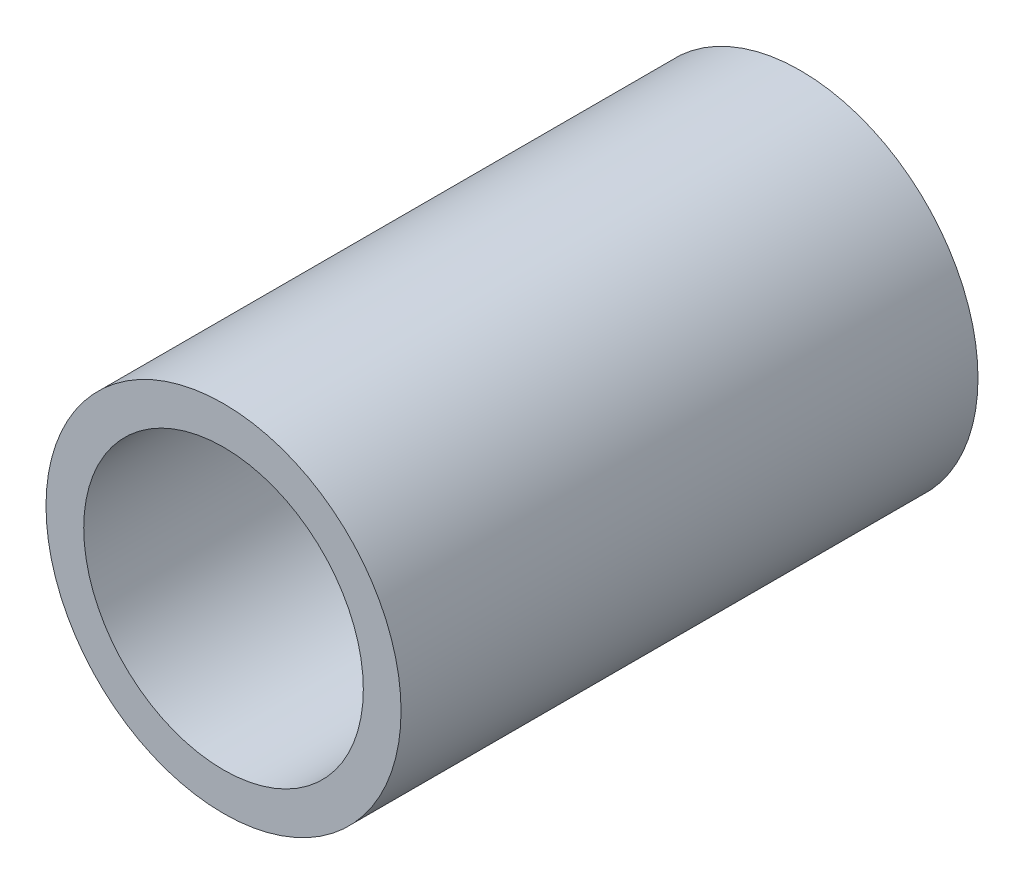
ISO-10303-21;
HEADER;
FILE_DESCRIPTION(('STEP AP214'),'2;1');
FILE_NAME('part.step','',(''),(''),'','','');
FILE_SCHEMA(('AUTOMOTIVE_DESIGN { 1 0 10303 214 1 1 1 1 }'));
ENDSEC;
DATA;
#1=APPLICATION_CONTEXT('core data for automotive mechanical design processes');
#2=APPLICATION_PROTOCOL_DEFINITION('international standard','automotive_design',2000,#1);
#3=PRODUCT_CONTEXT('',#1,'mechanical');
#4=PRODUCT('Part','Part','',(#3));
#5=PRODUCT_RELATED_PRODUCT_CATEGORY('part','',(#4));
#6=PRODUCT_DEFINITION_FORMATION('','',#4);
#7=PRODUCT_DEFINITION_CONTEXT('part definition',#1,'design');
#8=PRODUCT_DEFINITION('design','',#6,#7);
#9=PRODUCT_DEFINITION_SHAPE('','',#8);
#10=(LENGTH_UNIT() NAMED_UNIT(*) SI_UNIT(.MILLI.,.METRE.));
#11=(NAMED_UNIT(*) PLANE_ANGLE_UNIT() SI_UNIT($,.RADIAN.));
#12=(NAMED_UNIT(*) SI_UNIT($,.STERADIAN.) SOLID_ANGLE_UNIT());
#13=UNCERTAINTY_MEASURE_WITH_UNIT(LENGTH_MEASURE(1.E-05),#10,'distance_accuracy_value','');
#14=(GEOMETRIC_REPRESENTATION_CONTEXT(3) GLOBAL_UNCERTAINTY_ASSIGNED_CONTEXT((#13)) GLOBAL_UNIT_ASSIGNED_CONTEXT((#10,
#11,#12)) REPRESENTATION_CONTEXT('',''));
#15=CARTESIAN_POINT('',(0.,0.,0.));
#16=DIRECTION('',(0.,0.,1.));
#17=DIRECTION('',(1.,0.,0.));
#18=AXIS2_PLACEMENT_3D('',#15,#16,#17);
#19=CARTESIAN_POINT('',(130.584621174782,33.1760252329142,596.785052486104));
#20=DIRECTION('',(0.,0.,1.));
#21=DIRECTION('',(1.,0.,0.));
#22=AXIS2_PLACEMENT_3D('',#19,#20,#21);
#23=PLANE('',#22);
#24=CARTESIAN_POINT('',(130.584621174782,33.1760252329142,596.785052486104));
#25=DIRECTION('',(0.,0.,1.));
#26=DIRECTION('',(1.,0.,0.));
#27=AXIS2_PLACEMENT_3D('',#24,#25,#26);
#28=CIRCLE('',#27,126.);
#29=CARTESIAN_POINT('',(256.584621174782,33.1760252329142,596.785052486104));
#30=VERTEX_POINT('',#29);
#31=EDGE_CURVE('E59',#30,#30,#28,.T.);
#32=ORIENTED_EDGE('',*,*,#31,.F.);
#33=EDGE_LOOP('',(#32));
#34=FACE_BOUND('',#33,.T.);
#35=CARTESIAN_POINT('',(130.584621174782,33.1760252329142,596.785052486104));
#36=DIRECTION('',(0.,0.,1.));
#37=DIRECTION('',(1.,0.,0.));
#38=AXIS2_PLACEMENT_3D('',#35,#36,#37);
#39=CIRCLE('',#38,160.);
#40=CARTESIAN_POINT('',(290.584621174782,33.1760252329142,596.785052486104));
#41=VERTEX_POINT('',#40);
#42=EDGE_CURVE('E13',#41,#41,#39,.T.);
#43=ORIENTED_EDGE('',*,*,#42,.T.);
#44=EDGE_LOOP('',(#43));
#45=FACE_BOUND('',#44,.T.);
#46=ADVANCED_FACE('F48',(#34,#45),#23,.T.);
#47=CARTESIAN_POINT('',(130.584621174782,33.1760252329142,76.7850524861044));
#48=DIRECTION('',(0.,0.,1.));
#49=DIRECTION('',(1.,0.,0.));
#50=AXIS2_PLACEMENT_3D('',#47,#48,#49);
#51=PLANE('',#50);
#52=CARTESIAN_POINT('',(130.584621174782,33.1760252329142,76.7850524861044));
#53=DIRECTION('',(0.,0.,1.));
#54=DIRECTION('',(1.,0.,0.));
#55=AXIS2_PLACEMENT_3D('',#52,#53,#54);
#56=CIRCLE('',#55,160.);
#57=CARTESIAN_POINT('',(290.584621174782,33.1760252329142,76.7850524861044));
#58=VERTEX_POINT('',#57);
#59=EDGE_CURVE('E52',#58,#58,#56,.T.);
#60=ORIENTED_EDGE('',*,*,#59,.F.);
#61=EDGE_LOOP('',(#60));
#62=FACE_BOUND('',#61,.T.);
#63=CARTESIAN_POINT('',(130.584621174782,33.1760252329142,76.7850524861044));
#64=DIRECTION('',(0.,0.,1.));
#65=DIRECTION('',(1.,0.,0.));
#66=AXIS2_PLACEMENT_3D('',#63,#64,#65);
#67=CIRCLE('',#66,126.);
#68=CARTESIAN_POINT('',(256.584621174782,33.1760252329142,76.7850524861044));
#69=VERTEX_POINT('',#68);
#70=EDGE_CURVE('E61',#69,#69,#67,.T.);
#71=ORIENTED_EDGE('',*,*,#70,.T.);
#72=EDGE_LOOP('',(#71));
#73=FACE_BOUND('',#72,.T.);
#74=ADVANCED_FACE('F71',(#62,#73),#51,.F.);
#75=CARTESIAN_POINT('',(130.584621174782,33.1760252329142,596.785052486104));
#76=DIRECTION('',(0.,0.,-1.));
#77=DIRECTION('',(-1.,0.,0.));
#78=AXIS2_PLACEMENT_3D('',#75,#76,#77);
#79=CYLINDRICAL_SURFACE('',#78,160.);
#80=ORIENTED_EDGE('',*,*,#42,.F.);
#81=EDGE_LOOP('',(#80));
#82=FACE_BOUND('',#81,.T.);
#83=ORIENTED_EDGE('',*,*,#59,.T.);
#84=EDGE_LOOP('',(#83));
#85=FACE_BOUND('',#84,.T.);
#86=ADVANCED_FACE('F50',(#82,#85),#79,.T.);
#87=CARTESIAN_POINT('',(130.584621174782,33.1760252329142,596.785052486104));
#88=DIRECTION('',(0.,0.,-1.));
#89=DIRECTION('',(-1.,0.,0.));
#90=AXIS2_PLACEMENT_3D('',#87,#88,#89);
#91=CYLINDRICAL_SURFACE('',#90,126.);
#92=ORIENTED_EDGE('',*,*,#31,.T.);
#93=EDGE_LOOP('',(#92));
#94=FACE_BOUND('',#93,.T.);
#95=ORIENTED_EDGE('',*,*,#70,.F.);
#96=EDGE_LOOP('',(#95));
#97=FACE_BOUND('',#96,.T.);
#98=ADVANCED_FACE('F67',(#94,#97),#91,.F.);
#99=CLOSED_SHELL('',(#46,#74,#86,#98));
#100=MANIFOLD_SOLID_BREP('B2',#99);
#101=ADVANCED_BREP_SHAPE_REPRESENTATION('',(#18,#100),#14);
#102=SHAPE_DEFINITION_REPRESENTATION(#9,#101);
ENDSEC;
END-ISO-10303-21;
